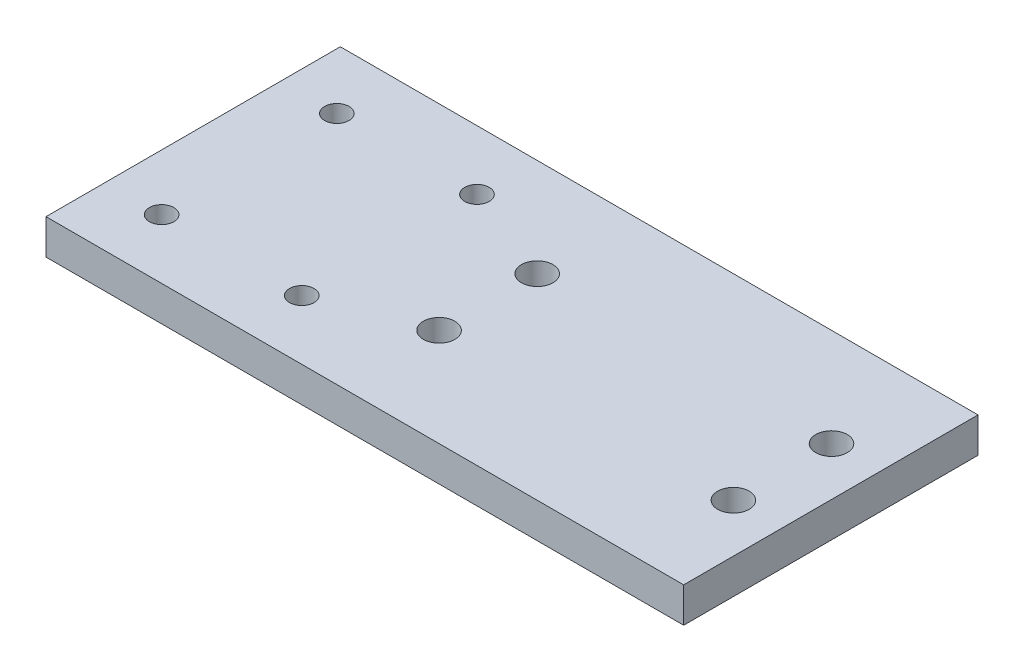
ISO-10303-21;
HEADER;
FILE_DESCRIPTION(('STEP AP214'),'2;1');
FILE_NAME('part.step','',(''),(''),'','','');
FILE_SCHEMA(('AUTOMOTIVE_DESIGN { 1 0 10303 214 1 1 1 1 }'));
ENDSEC;
DATA;
#1=APPLICATION_CONTEXT('core data for automotive mechanical design processes');
#2=APPLICATION_PROTOCOL_DEFINITION('international standard','automotive_design',2000,#1);
#3=PRODUCT_CONTEXT('',#1,'mechanical');
#4=PRODUCT('Part','Part','',(#3));
#5=PRODUCT_RELATED_PRODUCT_CATEGORY('part','',(#4));
#6=PRODUCT_DEFINITION_FORMATION('','',#4);
#7=PRODUCT_DEFINITION_CONTEXT('part definition',#1,'design');
#8=PRODUCT_DEFINITION('design','',#6,#7);
#9=PRODUCT_DEFINITION_SHAPE('','',#8);
#10=(LENGTH_UNIT() NAMED_UNIT(*) SI_UNIT(.MILLI.,.METRE.));
#11=(NAMED_UNIT(*) PLANE_ANGLE_UNIT() SI_UNIT($,.RADIAN.));
#12=(NAMED_UNIT(*) SI_UNIT($,.STERADIAN.) SOLID_ANGLE_UNIT());
#13=UNCERTAINTY_MEASURE_WITH_UNIT(LENGTH_MEASURE(1.E-05),#10,'distance_accuracy_value','');
#14=(GEOMETRIC_REPRESENTATION_CONTEXT(3) GLOBAL_UNCERTAINTY_ASSIGNED_CONTEXT((#13)) GLOBAL_UNIT_ASSIGNED_CONTEXT((#10,
#11,#12)) REPRESENTATION_CONTEXT('',''));
#15=CARTESIAN_POINT('',(0.,0.,0.));
#16=DIRECTION('',(0.,0.,1.));
#17=DIRECTION('',(1.,0.,0.));
#18=AXIS2_PLACEMENT_3D('',#15,#16,#17);
#19=CARTESIAN_POINT('',(0.,5.,0.));
#20=DIRECTION('',(1.,0.,0.));
#21=DIRECTION('',(0.,0.,-1.));
#22=AXIS2_PLACEMENT_3D('',#19,#20,#21);
#23=PLANE('',#22);
#24=DIRECTION('',(0.,0.,1.));
#25=VECTOR('',#24,1.);
#26=CARTESIAN_POINT('',(0.,0.,0.));
#27=LINE('',#26,#25);
#28=CARTESIAN_POINT('',(0.,0.,-42.));
#29=VERTEX_POINT('',#28);
#30=CARTESIAN_POINT('',(0.,0.,0.));
#31=VERTEX_POINT('',#30);
#32=EDGE_CURVE('E98',#29,#31,#27,.T.);
#33=ORIENTED_EDGE('',*,*,#32,.T.);
#34=DIRECTION('',(0.,-1.,0.));
#35=VECTOR('',#34,1.);
#36=CARTESIAN_POINT('',(0.,5.,0.));
#37=LINE('',#36,#35);
#38=CARTESIAN_POINT('',(0.,5.,0.));
#39=VERTEX_POINT('',#38);
#40=EDGE_CURVE('E11',#39,#31,#37,.T.);
#41=ORIENTED_EDGE('',*,*,#40,.F.);
#42=DIRECTION('',(0.,0.,1.));
#43=VECTOR('',#42,1.);
#44=CARTESIAN_POINT('',(0.,5.,0.));
#45=LINE('',#44,#43);
#46=CARTESIAN_POINT('',(0.,5.,-42.));
#47=VERTEX_POINT('',#46);
#48=EDGE_CURVE('E86',#47,#39,#45,.T.);
#49=ORIENTED_EDGE('',*,*,#48,.F.);
#50=DIRECTION('',(0.,-1.,0.));
#51=VECTOR('',#50,1.);
#52=CARTESIAN_POINT('',(0.,5.,-42.));
#53=LINE('',#52,#51);
#54=EDGE_CURVE('E94',#47,#29,#53,.T.);
#55=ORIENTED_EDGE('',*,*,#54,.T.);
#56=EDGE_LOOP('',(#33,#41,#49,#55));
#57=FACE_BOUND('',#56,.T.);
#58=ADVANCED_FACE('F35',(#57),#23,.F.);
#59=CARTESIAN_POINT('',(0.,5.,0.));
#60=DIRECTION('',(0.,0.,-1.));
#61=DIRECTION('',(-1.,0.,0.));
#62=AXIS2_PLACEMENT_3D('',#59,#60,#61);
#63=PLANE('',#62);
#64=DIRECTION('',(1.,0.,0.));
#65=VECTOR('',#64,1.);
#66=CARTESIAN_POINT('',(0.,0.,0.));
#67=LINE('',#66,#65);
#68=CARTESIAN_POINT('',(91.,0.,0.));
#69=VERTEX_POINT('',#68);
#70=EDGE_CURVE('E90',#31,#69,#67,.T.);
#71=ORIENTED_EDGE('',*,*,#70,.T.);
#72=DIRECTION('',(0.,-1.,0.));
#73=VECTOR('',#72,1.);
#74=CARTESIAN_POINT('',(91.,5.,0.));
#75=LINE('',#74,#73);
#76=CARTESIAN_POINT('',(91.,5.,0.));
#77=VERTEX_POINT('',#76);
#78=EDGE_CURVE('E43',#77,#69,#75,.T.);
#79=ORIENTED_EDGE('',*,*,#78,.F.);
#80=DIRECTION('',(1.,0.,0.));
#81=VECTOR('',#80,1.);
#82=CARTESIAN_POINT('',(0.,5.,0.));
#83=LINE('',#82,#81);
#84=EDGE_CURVE('E81',#39,#77,#83,.T.);
#85=ORIENTED_EDGE('',*,*,#84,.F.);
#86=ORIENTED_EDGE('',*,*,#40,.T.);
#87=EDGE_LOOP('',(#71,#79,#85,#86));
#88=FACE_BOUND('',#87,.T.);
#89=ADVANCED_FACE('F89',(#88),#63,.F.);
#90=CARTESIAN_POINT('',(91.,5.,0.));
#91=DIRECTION('',(-1.,0.,0.));
#92=DIRECTION('',(0.,0.,1.));
#93=AXIS2_PLACEMENT_3D('',#90,#91,#92);
#94=PLANE('',#93);
#95=DIRECTION('',(0.,0.,-1.));
#96=VECTOR('',#95,1.);
#97=CARTESIAN_POINT('',(91.,0.,0.));
#98=LINE('',#97,#96);
#99=CARTESIAN_POINT('',(91.,0.,-42.));
#100=VERTEX_POINT('',#99);
#101=EDGE_CURVE('E68',#69,#100,#98,.T.);
#102=ORIENTED_EDGE('',*,*,#101,.T.);
#103=DIRECTION('',(0.,-1.,0.));
#104=VECTOR('',#103,1.);
#105=CARTESIAN_POINT('',(91.,5.,-42.));
#106=LINE('',#105,#104);
#107=CARTESIAN_POINT('',(91.,5.,-42.));
#108=VERTEX_POINT('',#107);
#109=EDGE_CURVE('E91',#108,#100,#106,.T.);
#110=ORIENTED_EDGE('',*,*,#109,.F.);
#111=DIRECTION('',(0.,0.,-1.));
#112=VECTOR('',#111,1.);
#113=CARTESIAN_POINT('',(91.,5.,0.));
#114=LINE('',#113,#112);
#115=EDGE_CURVE('E84',#77,#108,#114,.T.);
#116=ORIENTED_EDGE('',*,*,#115,.F.);
#117=ORIENTED_EDGE('',*,*,#78,.T.);
#118=EDGE_LOOP('',(#102,#110,#116,#117));
#119=FACE_BOUND('',#118,.T.);
#120=ADVANCED_FACE('F92',(#119),#94,.F.);
#121=CARTESIAN_POINT('',(0.,5.,-42.));
#122=DIRECTION('',(0.,0.,1.));
#123=DIRECTION('',(1.,0.,0.));
#124=AXIS2_PLACEMENT_3D('',#121,#122,#123);
#125=PLANE('',#124);
#126=DIRECTION('',(-1.,0.,0.));
#127=VECTOR('',#126,1.);
#128=CARTESIAN_POINT('',(0.,0.,-42.));
#129=LINE('',#128,#127);
#130=EDGE_CURVE('E74',#100,#29,#129,.T.);
#131=ORIENTED_EDGE('',*,*,#130,.T.);
#132=ORIENTED_EDGE('',*,*,#54,.F.);
#133=DIRECTION('',(-1.,0.,0.));
#134=VECTOR('',#133,1.);
#135=CARTESIAN_POINT('',(0.,5.,-42.));
#136=LINE('',#135,#134);
#137=EDGE_CURVE('E51',#108,#47,#136,.T.);
#138=ORIENTED_EDGE('',*,*,#137,.F.);
#139=ORIENTED_EDGE('',*,*,#109,.T.);
#140=EDGE_LOOP('',(#131,#132,#138,#139));
#141=FACE_BOUND('',#140,.T.);
#142=ADVANCED_FACE('F106',(#141),#125,.F.);
#143=CARTESIAN_POINT('',(0.,5.,0.));
#144=DIRECTION('',(0.,-1.,0.));
#145=DIRECTION('',(0.,0.,-1.));
#146=AXIS2_PLACEMENT_3D('',#143,#144,#145);
#147=PLANE('',#146);
#148=CARTESIAN_POINT('',(84.0948730147645,5.,-28.));
#149=DIRECTION('',(0.,1.,0.));
#150=DIRECTION('',(0.,0.,1.));
#151=AXIS2_PLACEMENT_3D('',#148,#149,#150);
#152=CIRCLE('',#151,2.25);
#153=CARTESIAN_POINT('',(84.0948730147645,5.,-25.75));
#154=VERTEX_POINT('',#153);
#155=EDGE_CURVE('E154',#154,#154,#152,.T.);
#156=ORIENTED_EDGE('',*,*,#155,.F.);
#157=EDGE_LOOP('',(#156));
#158=FACE_BOUND('',#157,.T.);
#159=CARTESIAN_POINT('',(84.0948730147645,5.,-14.));
#160=DIRECTION('',(0.,1.,0.));
#161=DIRECTION('',(0.,0.,1.));
#162=AXIS2_PLACEMENT_3D('',#159,#160,#161);
#163=CIRCLE('',#162,2.25);
#164=CARTESIAN_POINT('',(84.0948730147645,5.,-11.75));
#165=VERTEX_POINT('',#164);
#166=EDGE_CURVE('E148',#165,#165,#163,.T.);
#167=ORIENTED_EDGE('',*,*,#166,.F.);
#168=EDGE_LOOP('',(#167));
#169=FACE_BOUND('',#168,.T.);
#170=CARTESIAN_POINT('',(42.0948730147645,5.,-14.));
#171=DIRECTION('',(0.,1.,0.));
#172=DIRECTION('',(0.,0.,1.));
#173=AXIS2_PLACEMENT_3D('',#170,#171,#172);
#174=CIRCLE('',#173,2.25);
#175=CARTESIAN_POINT('',(42.0948730147645,5.,-11.75));
#176=VERTEX_POINT('',#175);
#177=EDGE_CURVE('E142',#176,#176,#174,.T.);
#178=ORIENTED_EDGE('',*,*,#177,.F.);
#179=EDGE_LOOP('',(#178));
#180=FACE_BOUND('',#179,.T.);
#181=CARTESIAN_POINT('',(42.0948730147645,5.,-28.));
#182=DIRECTION('',(0.,1.,0.));
#183=DIRECTION('',(0.,0.,1.));
#184=AXIS2_PLACEMENT_3D('',#181,#182,#183);
#185=CIRCLE('',#184,2.25);
#186=CARTESIAN_POINT('',(42.0948730147645,5.,-25.75));
#187=VERTEX_POINT('',#186);
#188=EDGE_CURVE('E136',#187,#187,#185,.T.);
#189=ORIENTED_EDGE('',*,*,#188,.F.);
#190=EDGE_LOOP('',(#189));
#191=FACE_BOUND('',#190,.T.);
#192=CARTESIAN_POINT('',(8.,5.,-33.5));
#193=DIRECTION('',(0.,1.,0.));
#194=DIRECTION('',(0.,0.,1.));
#195=AXIS2_PLACEMENT_3D('',#192,#193,#194);
#196=CIRCLE('',#195,1.75);
#197=CARTESIAN_POINT('',(8.,5.,-31.75));
#198=VERTEX_POINT('',#197);
#199=EDGE_CURVE('E130',#198,#198,#196,.T.);
#200=ORIENTED_EDGE('',*,*,#199,.F.);
#201=EDGE_LOOP('',(#200));
#202=FACE_BOUND('',#201,.T.);
#203=CARTESIAN_POINT('',(28.,5.,-33.5));
#204=DIRECTION('',(0.,1.,0.));
#205=DIRECTION('',(0.,0.,1.));
#206=AXIS2_PLACEMENT_3D('',#203,#204,#205);
#207=CIRCLE('',#206,1.75);
#208=CARTESIAN_POINT('',(28.,5.,-31.75));
#209=VERTEX_POINT('',#208);
#210=EDGE_CURVE('E124',#209,#209,#207,.T.);
#211=ORIENTED_EDGE('',*,*,#210,.F.);
#212=EDGE_LOOP('',(#211));
#213=FACE_BOUND('',#212,.T.);
#214=CARTESIAN_POINT('',(8.,5.,-8.5));
#215=DIRECTION('',(0.,1.,0.));
#216=DIRECTION('',(0.,0.,1.));
#217=AXIS2_PLACEMENT_3D('',#214,#215,#216);
#218=CIRCLE('',#217,1.75);
#219=CARTESIAN_POINT('',(8.,5.,-6.75));
#220=VERTEX_POINT('',#219);
#221=EDGE_CURVE('E118',#220,#220,#218,.T.);
#222=ORIENTED_EDGE('',*,*,#221,.F.);
#223=EDGE_LOOP('',(#222));
#224=FACE_BOUND('',#223,.T.);
#225=CARTESIAN_POINT('',(28.,5.,-8.5));
#226=DIRECTION('',(0.,1.,0.));
#227=DIRECTION('',(0.,0.,1.));
#228=AXIS2_PLACEMENT_3D('',#225,#226,#227);
#229=CIRCLE('',#228,1.75);
#230=CARTESIAN_POINT('',(28.,5.,-6.75));
#231=VERTEX_POINT('',#230);
#232=EDGE_CURVE('E112',#231,#231,#229,.T.);
#233=ORIENTED_EDGE('',*,*,#232,.F.);
#234=EDGE_LOOP('',(#233));
#235=FACE_BOUND('',#234,.T.);
#236=ORIENTED_EDGE('',*,*,#48,.T.);
#237=ORIENTED_EDGE('',*,*,#84,.T.);
#238=ORIENTED_EDGE('',*,*,#115,.T.);
#239=ORIENTED_EDGE('',*,*,#137,.T.);
#240=EDGE_LOOP('',(#236,#237,#238,#239));
#241=FACE_BOUND('',#240,.T.);
#242=ADVANCED_FACE('F82',(#158,#169,#180,#191,#202,#213,#224,#235,#241),#147,.F.);
#243=CARTESIAN_POINT('',(0.,0.,0.));
#244=DIRECTION('',(0.,-1.,0.));
#245=DIRECTION('',(0.,0.,-1.));
#246=AXIS2_PLACEMENT_3D('',#243,#244,#245);
#247=PLANE('',#246);
#248=CARTESIAN_POINT('',(84.0948730147645,0.,-28.));
#249=DIRECTION('',(0.,1.,0.));
#250=DIRECTION('',(0.,0.,1.));
#251=AXIS2_PLACEMENT_3D('',#248,#249,#250);
#252=CIRCLE('',#251,2.25);
#253=CARTESIAN_POINT('',(84.0948730147645,0.,-25.75));
#254=VERTEX_POINT('',#253);
#255=EDGE_CURVE('E151',#254,#254,#252,.T.);
#256=ORIENTED_EDGE('',*,*,#255,.T.);
#257=EDGE_LOOP('',(#256));
#258=FACE_BOUND('',#257,.T.);
#259=CARTESIAN_POINT('',(84.0948730147645,0.,-14.));
#260=DIRECTION('',(0.,1.,0.));
#261=DIRECTION('',(0.,0.,1.));
#262=AXIS2_PLACEMENT_3D('',#259,#260,#261);
#263=CIRCLE('',#262,2.25);
#264=CARTESIAN_POINT('',(84.0948730147645,0.,-11.75));
#265=VERTEX_POINT('',#264);
#266=EDGE_CURVE('E145',#265,#265,#263,.T.);
#267=ORIENTED_EDGE('',*,*,#266,.T.);
#268=EDGE_LOOP('',(#267));
#269=FACE_BOUND('',#268,.T.);
#270=CARTESIAN_POINT('',(42.0948730147645,0.,-14.));
#271=DIRECTION('',(0.,1.,0.));
#272=DIRECTION('',(0.,0.,1.));
#273=AXIS2_PLACEMENT_3D('',#270,#271,#272);
#274=CIRCLE('',#273,2.25);
#275=CARTESIAN_POINT('',(42.0948730147645,0.,-11.75));
#276=VERTEX_POINT('',#275);
#277=EDGE_CURVE('E139',#276,#276,#274,.T.);
#278=ORIENTED_EDGE('',*,*,#277,.T.);
#279=EDGE_LOOP('',(#278));
#280=FACE_BOUND('',#279,.T.);
#281=CARTESIAN_POINT('',(42.0948730147645,0.,-28.));
#282=DIRECTION('',(0.,1.,0.));
#283=DIRECTION('',(0.,0.,1.));
#284=AXIS2_PLACEMENT_3D('',#281,#282,#283);
#285=CIRCLE('',#284,2.25);
#286=CARTESIAN_POINT('',(42.0948730147645,0.,-25.75));
#287=VERTEX_POINT('',#286);
#288=EDGE_CURVE('E133',#287,#287,#285,.T.);
#289=ORIENTED_EDGE('',*,*,#288,.T.);
#290=EDGE_LOOP('',(#289));
#291=FACE_BOUND('',#290,.T.);
#292=CARTESIAN_POINT('',(8.,0.,-33.5));
#293=DIRECTION('',(0.,1.,0.));
#294=DIRECTION('',(0.,0.,1.));
#295=AXIS2_PLACEMENT_3D('',#292,#293,#294);
#296=CIRCLE('',#295,1.75);
#297=CARTESIAN_POINT('',(8.,0.,-31.75));
#298=VERTEX_POINT('',#297);
#299=EDGE_CURVE('E127',#298,#298,#296,.T.);
#300=ORIENTED_EDGE('',*,*,#299,.T.);
#301=EDGE_LOOP('',(#300));
#302=FACE_BOUND('',#301,.T.);
#303=CARTESIAN_POINT('',(28.,0.,-33.5));
#304=DIRECTION('',(0.,1.,0.));
#305=DIRECTION('',(0.,0.,1.));
#306=AXIS2_PLACEMENT_3D('',#303,#304,#305);
#307=CIRCLE('',#306,1.75);
#308=CARTESIAN_POINT('',(28.,0.,-31.75));
#309=VERTEX_POINT('',#308);
#310=EDGE_CURVE('E121',#309,#309,#307,.T.);
#311=ORIENTED_EDGE('',*,*,#310,.T.);
#312=EDGE_LOOP('',(#311));
#313=FACE_BOUND('',#312,.T.);
#314=CARTESIAN_POINT('',(8.,0.,-8.5));
#315=DIRECTION('',(0.,1.,0.));
#316=DIRECTION('',(0.,0.,1.));
#317=AXIS2_PLACEMENT_3D('',#314,#315,#316);
#318=CIRCLE('',#317,1.75);
#319=CARTESIAN_POINT('',(8.,0.,-6.75));
#320=VERTEX_POINT('',#319);
#321=EDGE_CURVE('E115',#320,#320,#318,.T.);
#322=ORIENTED_EDGE('',*,*,#321,.T.);
#323=EDGE_LOOP('',(#322));
#324=FACE_BOUND('',#323,.T.);
#325=CARTESIAN_POINT('',(28.,0.,-8.5));
#326=DIRECTION('',(0.,1.,0.));
#327=DIRECTION('',(0.,0.,1.));
#328=AXIS2_PLACEMENT_3D('',#325,#326,#327);
#329=CIRCLE('',#328,1.75);
#330=CARTESIAN_POINT('',(28.,0.,-6.75));
#331=VERTEX_POINT('',#330);
#332=EDGE_CURVE('E101',#331,#331,#329,.T.);
#333=ORIENTED_EDGE('',*,*,#332,.T.);
#334=EDGE_LOOP('',(#333));
#335=FACE_BOUND('',#334,.T.);
#336=ORIENTED_EDGE('',*,*,#32,.F.);
#337=ORIENTED_EDGE('',*,*,#130,.F.);
#338=ORIENTED_EDGE('',*,*,#101,.F.);
#339=ORIENTED_EDGE('',*,*,#70,.F.);
#340=EDGE_LOOP('',(#336,#337,#338,#339));
#341=FACE_BOUND('',#340,.T.);
#342=ADVANCED_FACE('F109',(#258,#269,#280,#291,#302,#313,#324,#335,#341),#247,.T.);
#343=CARTESIAN_POINT('',(28.,0.,-8.5));
#344=DIRECTION('',(0.,1.,0.));
#345=DIRECTION('',(0.,0.,1.));
#346=AXIS2_PLACEMENT_3D('',#343,#344,#345);
#347=CYLINDRICAL_SURFACE('',#346,1.75);
#348=ORIENTED_EDGE('',*,*,#332,.F.);
#349=EDGE_LOOP('',(#348));
#350=FACE_BOUND('',#349,.T.);
#351=ORIENTED_EDGE('',*,*,#232,.T.);
#352=EDGE_LOOP('',(#351));
#353=FACE_BOUND('',#352,.T.);
#354=ADVANCED_FACE('F186',(#350,#353),#347,.F.);
#355=CARTESIAN_POINT('',(8.,0.,-8.5));
#356=DIRECTION('',(0.,1.,0.));
#357=DIRECTION('',(0.,0.,1.));
#358=AXIS2_PLACEMENT_3D('',#355,#356,#357);
#359=CYLINDRICAL_SURFACE('',#358,1.75);
#360=ORIENTED_EDGE('',*,*,#321,.F.);
#361=EDGE_LOOP('',(#360));
#362=FACE_BOUND('',#361,.T.);
#363=ORIENTED_EDGE('',*,*,#221,.T.);
#364=EDGE_LOOP('',(#363));
#365=FACE_BOUND('',#364,.T.);
#366=ADVANCED_FACE('F188',(#362,#365),#359,.F.);
#367=CARTESIAN_POINT('',(28.,0.,-33.5));
#368=DIRECTION('',(0.,1.,0.));
#369=DIRECTION('',(0.,0.,1.));
#370=AXIS2_PLACEMENT_3D('',#367,#368,#369);
#371=CYLINDRICAL_SURFACE('',#370,1.75);
#372=ORIENTED_EDGE('',*,*,#310,.F.);
#373=EDGE_LOOP('',(#372));
#374=FACE_BOUND('',#373,.T.);
#375=ORIENTED_EDGE('',*,*,#210,.T.);
#376=EDGE_LOOP('',(#375));
#377=FACE_BOUND('',#376,.T.);
#378=ADVANCED_FACE('F195',(#374,#377),#371,.F.);
#379=CARTESIAN_POINT('',(8.,0.,-33.5));
#380=DIRECTION('',(0.,1.,0.));
#381=DIRECTION('',(0.,0.,1.));
#382=AXIS2_PLACEMENT_3D('',#379,#380,#381);
#383=CYLINDRICAL_SURFACE('',#382,1.75);
#384=ORIENTED_EDGE('',*,*,#299,.F.);
#385=EDGE_LOOP('',(#384));
#386=FACE_BOUND('',#385,.T.);
#387=ORIENTED_EDGE('',*,*,#199,.T.);
#388=EDGE_LOOP('',(#387));
#389=FACE_BOUND('',#388,.T.);
#390=ADVANCED_FACE('F241',(#386,#389),#383,.F.);
#391=CARTESIAN_POINT('',(42.0948730147645,0.,-28.));
#392=DIRECTION('',(0.,1.,0.));
#393=DIRECTION('',(0.,0.,1.));
#394=AXIS2_PLACEMENT_3D('',#391,#392,#393);
#395=CYLINDRICAL_SURFACE('',#394,2.25);
#396=ORIENTED_EDGE('',*,*,#288,.F.);
#397=EDGE_LOOP('',(#396));
#398=FACE_BOUND('',#397,.T.);
#399=ORIENTED_EDGE('',*,*,#188,.T.);
#400=EDGE_LOOP('',(#399));
#401=FACE_BOUND('',#400,.T.);
#402=ADVANCED_FACE('F251',(#398,#401),#395,.F.);
#403=CARTESIAN_POINT('',(42.0948730147645,0.,-14.));
#404=DIRECTION('',(0.,1.,0.));
#405=DIRECTION('',(0.,0.,1.));
#406=AXIS2_PLACEMENT_3D('',#403,#404,#405);
#407=CYLINDRICAL_SURFACE('',#406,2.25);
#408=ORIENTED_EDGE('',*,*,#277,.F.);
#409=EDGE_LOOP('',(#408));
#410=FACE_BOUND('',#409,.T.);
#411=ORIENTED_EDGE('',*,*,#177,.T.);
#412=EDGE_LOOP('',(#411));
#413=FACE_BOUND('',#412,.T.);
#414=ADVANCED_FACE('F261',(#410,#413),#407,.F.);
#415=CARTESIAN_POINT('',(84.0948730147645,0.,-14.));
#416=DIRECTION('',(0.,1.,0.));
#417=DIRECTION('',(0.,0.,1.));
#418=AXIS2_PLACEMENT_3D('',#415,#416,#417);
#419=CYLINDRICAL_SURFACE('',#418,2.25);
#420=ORIENTED_EDGE('',*,*,#266,.F.);
#421=EDGE_LOOP('',(#420));
#422=FACE_BOUND('',#421,.T.);
#423=ORIENTED_EDGE('',*,*,#166,.T.);
#424=EDGE_LOOP('',(#423));
#425=FACE_BOUND('',#424,.T.);
#426=ADVANCED_FACE('F165',(#422,#425),#419,.F.);
#427=CARTESIAN_POINT('',(84.0948730147645,0.,-28.));
#428=DIRECTION('',(0.,1.,0.));
#429=DIRECTION('',(0.,0.,1.));
#430=AXIS2_PLACEMENT_3D('',#427,#428,#429);
#431=CYLINDRICAL_SURFACE('',#430,2.25);
#432=ORIENTED_EDGE('',*,*,#255,.F.);
#433=EDGE_LOOP('',(#432));
#434=FACE_BOUND('',#433,.T.);
#435=ORIENTED_EDGE('',*,*,#155,.T.);
#436=EDGE_LOOP('',(#435));
#437=FACE_BOUND('',#436,.T.);
#438=ADVANCED_FACE('F162',(#434,#437),#431,.F.);
#439=CLOSED_SHELL('',(#58,#89,#120,#142,#242,#342,#354,#366,#378,#390,#402,#414,#426,#438));
#440=MANIFOLD_SOLID_BREP('B2',#439);
#441=ADVANCED_BREP_SHAPE_REPRESENTATION('',(#18,#440),#14);
#442=SHAPE_DEFINITION_REPRESENTATION(#9,#441);
ENDSEC;
END-ISO-10303-21;
